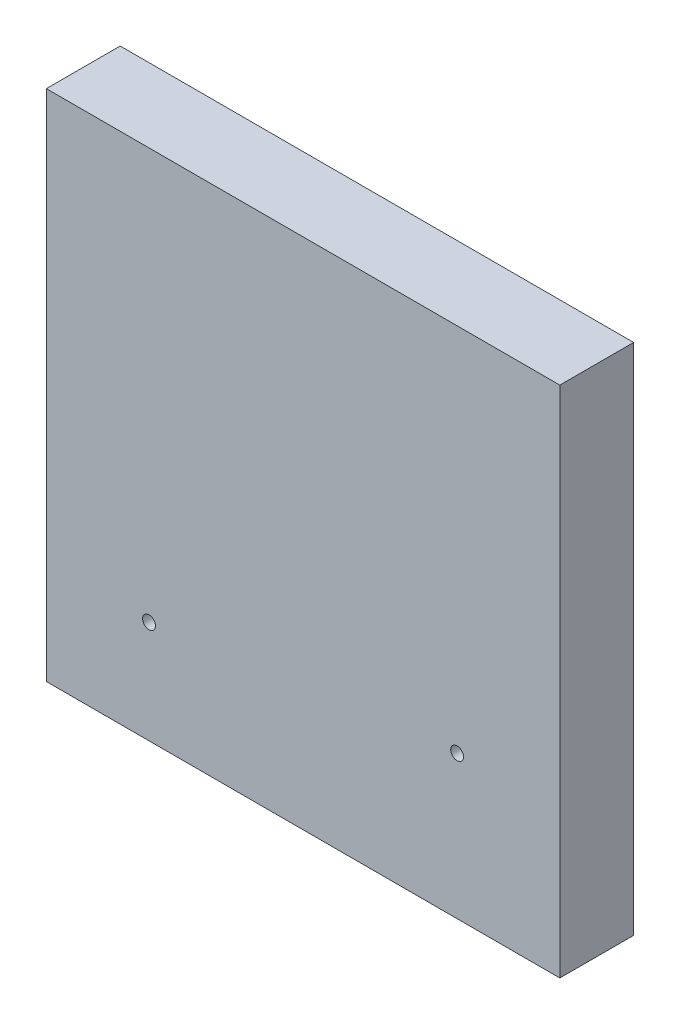
ISO-10303-21;
HEADER;
FILE_DESCRIPTION(('STEP AP214'),'2;1');
FILE_NAME('part.step','',(''),(''),'','','');
FILE_SCHEMA(('AUTOMOTIVE_DESIGN { 1 0 10303 214 1 1 1 1 }'));
ENDSEC;
DATA;
#1=APPLICATION_CONTEXT('core data for automotive mechanical design processes');
#2=APPLICATION_PROTOCOL_DEFINITION('international standard','automotive_design',2000,#1);
#3=PRODUCT_CONTEXT('',#1,'mechanical');
#4=PRODUCT('Part','Part','',(#3));
#5=PRODUCT_RELATED_PRODUCT_CATEGORY('part','',(#4));
#6=PRODUCT_DEFINITION_FORMATION('','',#4);
#7=PRODUCT_DEFINITION_CONTEXT('part definition',#1,'design');
#8=PRODUCT_DEFINITION('design','',#6,#7);
#9=PRODUCT_DEFINITION_SHAPE('','',#8);
#10=(LENGTH_UNIT() NAMED_UNIT(*) SI_UNIT(.MILLI.,.METRE.));
#11=(NAMED_UNIT(*) PLANE_ANGLE_UNIT() SI_UNIT($,.RADIAN.));
#12=(NAMED_UNIT(*) SI_UNIT($,.STERADIAN.) SOLID_ANGLE_UNIT());
#13=UNCERTAINTY_MEASURE_WITH_UNIT(LENGTH_MEASURE(1.E-05),#10,'distance_accuracy_value','');
#14=(GEOMETRIC_REPRESENTATION_CONTEXT(3) GLOBAL_UNCERTAINTY_ASSIGNED_CONTEXT((#13)) GLOBAL_UNIT_ASSIGNED_CONTEXT((#10,
#11,#12)) REPRESENTATION_CONTEXT('',''));
#15=CARTESIAN_POINT('',(0.,0.,0.));
#16=DIRECTION('',(0.,0.,1.));
#17=DIRECTION('',(1.,0.,0.));
#18=AXIS2_PLACEMENT_3D('',#15,#16,#17);
#19=CARTESIAN_POINT('',(0.,0.,18.2626));
#20=DIRECTION('',(0.,0.,-1.));
#21=DIRECTION('',(-1.,0.,0.));
#22=AXIS2_PLACEMENT_3D('',#19,#20,#21);
#23=PLANE('',#22);
#24=DIRECTION('',(0.,-1.,0.));
#25=VECTOR('',#24,1.);
#26=CARTESIAN_POINT('',(0.,0.,18.2626));
#27=LINE('',#26,#25);
#28=CARTESIAN_POINT('',(0.,127.,18.2626));
#29=VERTEX_POINT('',#28);
#30=CARTESIAN_POINT('',(0.,0.,18.2626));
#31=VERTEX_POINT('',#30);
#32=EDGE_CURVE('E116',#29,#31,#27,.T.);
#33=ORIENTED_EDGE('',*,*,#32,.T.);
#34=DIRECTION('',(1.,0.,0.));
#35=VECTOR('',#34,1.);
#36=CARTESIAN_POINT('',(0.,0.,18.2626));
#37=LINE('',#36,#35);
#38=CARTESIAN_POINT('',(127.,0.,18.2626));
#39=VERTEX_POINT('',#38);
#40=EDGE_CURVE('E111',#31,#39,#37,.T.);
#41=ORIENTED_EDGE('',*,*,#40,.T.);
#42=DIRECTION('',(0.,1.,0.));
#43=VECTOR('',#42,1.);
#44=CARTESIAN_POINT('',(127.,0.,18.2626));
#45=LINE('',#44,#43);
#46=CARTESIAN_POINT('',(127.,127.,18.2626));
#47=VERTEX_POINT('',#46);
#48=EDGE_CURVE('E114',#39,#47,#45,.T.);
#49=ORIENTED_EDGE('',*,*,#48,.T.);
#50=DIRECTION('',(-1.,0.,0.));
#51=VECTOR('',#50,1.);
#52=CARTESIAN_POINT('',(0.,127.,18.2626));
#53=LINE('',#52,#51);
#54=EDGE_CURVE('E76',#47,#29,#53,.T.);
#55=ORIENTED_EDGE('',*,*,#54,.T.);
#56=EDGE_LOOP('',(#33,#41,#49,#55));
#57=FACE_BOUND('',#56,.T.);
#58=CARTESIAN_POINT('',(25.4,25.4,18.2626));
#59=DIRECTION('',(0.,0.,1.));
#60=DIRECTION('',(1.,0.,0.));
#61=AXIS2_PLACEMENT_3D('',#58,#59,#60);
#62=CIRCLE('',#61,1.5875);
#63=CARTESIAN_POINT('',(26.9875,25.4,18.2626));
#64=VERTEX_POINT('',#63);
#65=EDGE_CURVE('E137',#64,#64,#62,.T.);
#66=ORIENTED_EDGE('',*,*,#65,.F.);
#67=EDGE_LOOP('',(#66));
#68=FACE_BOUND('',#67,.T.);
#69=CARTESIAN_POINT('',(101.6,35.433,18.2626));
#70=DIRECTION('',(0.,0.,1.));
#71=DIRECTION('',(1.,0.,0.));
#72=AXIS2_PLACEMENT_3D('',#69,#70,#71);
#73=CIRCLE('',#72,1.58749999999999);
#74=CARTESIAN_POINT('',(103.1875,35.433,18.2626));
#75=VERTEX_POINT('',#74);
#76=EDGE_CURVE('E159',#75,#75,#73,.T.);
#77=ORIENTED_EDGE('',*,*,#76,.F.);
#78=EDGE_LOOP('',(#77));
#79=FACE_BOUND('',#78,.T.);
#80=ADVANCED_FACE('F55',(#57,#68,#79),#23,.F.);
#81=CARTESIAN_POINT('',(0.,0.,0.));
#82=DIRECTION('',(0.,0.,-1.));
#83=DIRECTION('',(-1.,0.,0.));
#84=AXIS2_PLACEMENT_3D('',#81,#82,#83);
#85=PLANE('',#84);
#86=CARTESIAN_POINT('',(25.4,25.4,0.));
#87=DIRECTION('',(0.,0.,1.));
#88=DIRECTION('',(1.,0.,0.));
#89=AXIS2_PLACEMENT_3D('',#86,#87,#88);
#90=CIRCLE('',#89,1.5875);
#91=CARTESIAN_POINT('',(26.9875,25.4,0.));
#92=VERTEX_POINT('',#91);
#93=EDGE_CURVE('E155',#92,#92,#90,.T.);
#94=ORIENTED_EDGE('',*,*,#93,.T.);
#95=EDGE_LOOP('',(#94));
#96=FACE_BOUND('',#95,.T.);
#97=DIRECTION('',(0.,-1.,0.));
#98=VECTOR('',#97,1.);
#99=CARTESIAN_POINT('',(0.,0.,0.));
#100=LINE('',#99,#98);
#101=CARTESIAN_POINT('',(0.,127.,0.));
#102=VERTEX_POINT('',#101);
#103=CARTESIAN_POINT('',(0.,0.,0.));
#104=VERTEX_POINT('',#103);
#105=EDGE_CURVE('E133',#102,#104,#100,.T.);
#106=ORIENTED_EDGE('',*,*,#105,.F.);
#107=DIRECTION('',(-1.,0.,0.));
#108=VECTOR('',#107,1.);
#109=CARTESIAN_POINT('',(0.,127.,0.));
#110=LINE('',#109,#108);
#111=CARTESIAN_POINT('',(127.,127.,0.));
#112=VERTEX_POINT('',#111);
#113=EDGE_CURVE('E104',#112,#102,#110,.T.);
#114=ORIENTED_EDGE('',*,*,#113,.F.);
#115=DIRECTION('',(0.,1.,0.));
#116=VECTOR('',#115,1.);
#117=CARTESIAN_POINT('',(127.,0.,0.));
#118=LINE('',#117,#116);
#119=CARTESIAN_POINT('',(127.,0.,0.));
#120=VERTEX_POINT('',#119);
#121=EDGE_CURVE('E98',#120,#112,#118,.T.);
#122=ORIENTED_EDGE('',*,*,#121,.F.);
#123=DIRECTION('',(1.,0.,0.));
#124=VECTOR('',#123,1.);
#125=CARTESIAN_POINT('',(0.,0.,0.));
#126=LINE('',#125,#124);
#127=EDGE_CURVE('E121',#104,#120,#126,.T.);
#128=ORIENTED_EDGE('',*,*,#127,.F.);
#129=EDGE_LOOP('',(#106,#114,#122,#128));
#130=FACE_BOUND('',#129,.T.);
#131=CARTESIAN_POINT('',(101.6,35.433,0.));
#132=DIRECTION('',(0.,0.,1.));
#133=DIRECTION('',(1.,0.,0.));
#134=AXIS2_PLACEMENT_3D('',#131,#132,#133);
#135=CIRCLE('',#134,1.58749999999999);
#136=CARTESIAN_POINT('',(103.1875,35.433,0.));
#137=VERTEX_POINT('',#136);
#138=EDGE_CURVE('E163',#137,#137,#135,.T.);
#139=ORIENTED_EDGE('',*,*,#138,.T.);
#140=EDGE_LOOP('',(#139));
#141=FACE_BOUND('',#140,.T.);
#142=ADVANCED_FACE('F151',(#96,#130,#141),#85,.T.);
#143=CARTESIAN_POINT('',(0.,0.,18.2626));
#144=DIRECTION('',(1.,0.,0.));
#145=DIRECTION('',(0.,0.,-1.));
#146=AXIS2_PLACEMENT_3D('',#143,#144,#145);
#147=PLANE('',#146);
#148=ORIENTED_EDGE('',*,*,#105,.T.);
#149=DIRECTION('',(0.,0.,-1.));
#150=VECTOR('',#149,1.);
#151=CARTESIAN_POINT('',(0.,0.,18.2626));
#152=LINE('',#151,#150);
#153=EDGE_CURVE('E13',#31,#104,#152,.T.);
#154=ORIENTED_EDGE('',*,*,#153,.F.);
#155=ORIENTED_EDGE('',*,*,#32,.F.);
#156=DIRECTION('',(0.,0.,-1.));
#157=VECTOR('',#156,1.);
#158=CARTESIAN_POINT('',(0.,127.,18.2626));
#159=LINE('',#158,#157);
#160=EDGE_CURVE('E129',#29,#102,#159,.T.);
#161=ORIENTED_EDGE('',*,*,#160,.T.);
#162=EDGE_LOOP('',(#148,#154,#155,#161));
#163=FACE_BOUND('',#162,.T.);
#164=ADVANCED_FACE('F57',(#163),#147,.F.);
#165=CARTESIAN_POINT('',(0.,0.,18.2626));
#166=DIRECTION('',(0.,1.,0.));
#167=DIRECTION('',(0.,0.,1.));
#168=AXIS2_PLACEMENT_3D('',#165,#166,#167);
#169=PLANE('',#168);
#170=ORIENTED_EDGE('',*,*,#127,.T.);
#171=DIRECTION('',(0.,0.,-1.));
#172=VECTOR('',#171,1.);
#173=CARTESIAN_POINT('',(127.,0.,18.2626));
#174=LINE('',#173,#172);
#175=EDGE_CURVE('E65',#39,#120,#174,.T.);
#176=ORIENTED_EDGE('',*,*,#175,.F.);
#177=ORIENTED_EDGE('',*,*,#40,.F.);
#178=ORIENTED_EDGE('',*,*,#153,.T.);
#179=EDGE_LOOP('',(#170,#176,#177,#178));
#180=FACE_BOUND('',#179,.T.);
#181=ADVANCED_FACE('F120',(#180),#169,.F.);
#182=CARTESIAN_POINT('',(127.,0.,18.2626));
#183=DIRECTION('',(-1.,0.,0.));
#184=DIRECTION('',(0.,0.,1.));
#185=AXIS2_PLACEMENT_3D('',#182,#183,#184);
#186=PLANE('',#185);
#187=ORIENTED_EDGE('',*,*,#121,.T.);
#188=DIRECTION('',(0.,0.,-1.));
#189=VECTOR('',#188,1.);
#190=CARTESIAN_POINT('',(127.,127.,18.2626));
#191=LINE('',#190,#189);
#192=EDGE_CURVE('E123',#47,#112,#191,.T.);
#193=ORIENTED_EDGE('',*,*,#192,.F.);
#194=ORIENTED_EDGE('',*,*,#48,.F.);
#195=ORIENTED_EDGE('',*,*,#175,.T.);
#196=EDGE_LOOP('',(#187,#193,#194,#195));
#197=FACE_BOUND('',#196,.T.);
#198=ADVANCED_FACE('F124',(#197),#186,.F.);
#199=CARTESIAN_POINT('',(0.,127.,18.2626));
#200=DIRECTION('',(0.,-1.,0.));
#201=DIRECTION('',(0.,0.,-1.));
#202=AXIS2_PLACEMENT_3D('',#199,#200,#201);
#203=PLANE('',#202);
#204=ORIENTED_EDGE('',*,*,#113,.T.);
#205=ORIENTED_EDGE('',*,*,#160,.F.);
#206=ORIENTED_EDGE('',*,*,#54,.F.);
#207=ORIENTED_EDGE('',*,*,#192,.T.);
#208=EDGE_LOOP('',(#204,#205,#206,#207));
#209=FACE_BOUND('',#208,.T.);
#210=ADVANCED_FACE('F148',(#209),#203,.F.);
#211=CARTESIAN_POINT('',(25.4,25.4,18.2626));
#212=DIRECTION('',(0.,0.,-1.));
#213=DIRECTION('',(-1.,0.,0.));
#214=AXIS2_PLACEMENT_3D('',#211,#212,#213);
#215=CYLINDRICAL_SURFACE('',#214,1.5875);
#216=ORIENTED_EDGE('',*,*,#65,.T.);
#217=EDGE_LOOP('',(#216));
#218=FACE_BOUND('',#217,.T.);
#219=ORIENTED_EDGE('',*,*,#93,.F.);
#220=EDGE_LOOP('',(#219));
#221=FACE_BOUND('',#220,.T.);
#222=ADVANCED_FACE('F181',(#218,#221),#215,.F.);
#223=CARTESIAN_POINT('',(101.6,35.433,18.2626));
#224=DIRECTION('',(0.,0.,-1.));
#225=DIRECTION('',(-1.,0.,0.));
#226=AXIS2_PLACEMENT_3D('',#223,#224,#225);
#227=CYLINDRICAL_SURFACE('',#226,1.58749999999999);
#228=ORIENTED_EDGE('',*,*,#76,.T.);
#229=EDGE_LOOP('',(#228));
#230=FACE_BOUND('',#229,.T.);
#231=ORIENTED_EDGE('',*,*,#138,.F.);
#232=EDGE_LOOP('',(#231));
#233=FACE_BOUND('',#232,.T.);
#234=ADVANCED_FACE('F170',(#230,#233),#227,.F.);
#235=CLOSED_SHELL('',(#80,#142,#164,#181,#198,#210,#222,#234));
#236=MANIFOLD_SOLID_BREP('B2',#235);
#237=ADVANCED_BREP_SHAPE_REPRESENTATION('',(#18,#236),#14);
#238=SHAPE_DEFINITION_REPRESENTATION(#9,#237);
ENDSEC;
END-ISO-10303-21;
